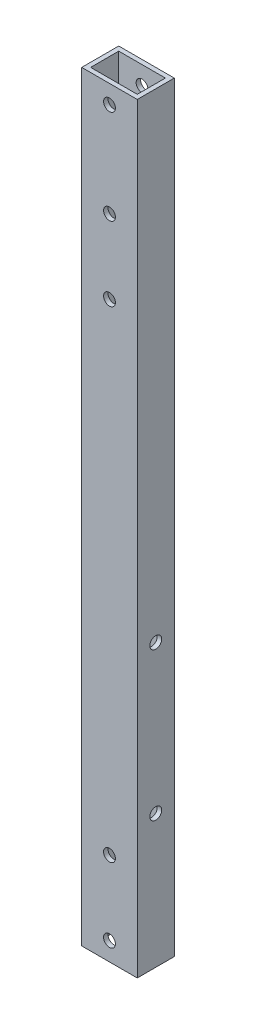
ISO-10303-21;
HEADER;
FILE_DESCRIPTION(('STEP AP214'),'2;1');
FILE_NAME('part.step','',(''),(''),'','','');
FILE_SCHEMA(('AUTOMOTIVE_DESIGN { 1 0 10303 214 1 1 1 1 }'));
ENDSEC;
DATA;
#1=APPLICATION_CONTEXT('core data for automotive mechanical design processes');
#2=APPLICATION_PROTOCOL_DEFINITION('international standard','automotive_design',2000,#1);
#3=PRODUCT_CONTEXT('',#1,'mechanical');
#4=PRODUCT('Part','Part','',(#3));
#5=PRODUCT_RELATED_PRODUCT_CATEGORY('part','',(#4));
#6=PRODUCT_DEFINITION_FORMATION('','',#4);
#7=PRODUCT_DEFINITION_CONTEXT('part definition',#1,'design');
#8=PRODUCT_DEFINITION('design','',#6,#7);
#9=PRODUCT_DEFINITION_SHAPE('','',#8);
#10=(LENGTH_UNIT() NAMED_UNIT(*) SI_UNIT(.MILLI.,.METRE.));
#11=(NAMED_UNIT(*) PLANE_ANGLE_UNIT() SI_UNIT($,.RADIAN.));
#12=(NAMED_UNIT(*) SI_UNIT($,.STERADIAN.) SOLID_ANGLE_UNIT());
#13=UNCERTAINTY_MEASURE_WITH_UNIT(LENGTH_MEASURE(1.E-05),#10,'distance_accuracy_value','');
#14=(GEOMETRIC_REPRESENTATION_CONTEXT(3) GLOBAL_UNCERTAINTY_ASSIGNED_CONTEXT((#13)) GLOBAL_UNIT_ASSIGNED_CONTEXT((#10,
#11,#12)) REPRESENTATION_CONTEXT('',''));
#15=CARTESIAN_POINT('',(0.,0.,0.));
#16=DIRECTION('',(0.,0.,1.));
#17=DIRECTION('',(1.,0.,0.));
#18=AXIS2_PLACEMENT_3D('',#15,#16,#17);
#19=CARTESIAN_POINT('',(7.5,110.,-5.));
#20=DIRECTION('',(-1.,0.,0.));
#21=DIRECTION('',(0.,0.,1.));
#22=AXIS2_PLACEMENT_3D('',#19,#20,#21);
#23=PLANE('',#22);
#24=CARTESIAN_POINT('',(7.5,-34.,0.));
#25=DIRECTION('',(-1.,0.,0.));
#26=DIRECTION('',(0.,0.,1.));
#27=AXIS2_PLACEMENT_3D('',#24,#25,#26);
#28=CIRCLE('',#27,1.6);
#29=CARTESIAN_POINT('',(7.5,-34.,1.60000000000005));
#30=VERTEX_POINT('',#29);
#31=EDGE_CURVE('E169',#30,#30,#28,.T.);
#32=ORIENTED_EDGE('',*,*,#31,.T.);
#33=EDGE_LOOP('',(#32));
#34=FACE_BOUND('',#33,.T.);
#35=CARTESIAN_POINT('',(7.5,-74.,0.));
#36=DIRECTION('',(-1.,0.,0.));
#37=DIRECTION('',(0.,0.,1.));
#38=AXIS2_PLACEMENT_3D('',#35,#36,#37);
#39=CIRCLE('',#38,1.6);
#40=CARTESIAN_POINT('',(7.5,-74.,1.60000000000007));
#41=VERTEX_POINT('',#40);
#42=EDGE_CURVE('E138',#41,#41,#39,.T.);
#43=ORIENTED_EDGE('',*,*,#42,.T.);
#44=EDGE_LOOP('',(#43));
#45=FACE_BOUND('',#44,.T.);
#46=DIRECTION('',(0.,0.,-1.));
#47=VECTOR('',#46,1.);
#48=CARTESIAN_POINT('',(7.5,95.5,5.));
#49=LINE('',#48,#47);
#50=CARTESIAN_POINT('',(7.5,95.5,5.));
#51=VERTEX_POINT('',#50);
#52=CARTESIAN_POINT('',(7.5,95.5,-5.));
#53=VERTEX_POINT('',#52);
#54=EDGE_CURVE('E96',#51,#53,#49,.T.);
#55=ORIENTED_EDGE('',*,*,#54,.F.);
#56=DIRECTION('',(0.,-1.,0.));
#57=VECTOR('',#56,1.);
#58=CARTESIAN_POINT('',(7.5,110.,5.));
#59=LINE('',#58,#57);
#60=CARTESIAN_POINT('',(7.5,-110.,5.));
#61=VERTEX_POINT('',#60);
#62=EDGE_CURVE('E106',#51,#61,#59,.T.);
#63=ORIENTED_EDGE('',*,*,#62,.T.);
#64=DIRECTION('',(0.,0.,-1.));
#65=VECTOR('',#64,1.);
#66=CARTESIAN_POINT('',(7.5,-110.,-5.));
#67=LINE('',#66,#65);
#68=CARTESIAN_POINT('',(7.5,-110.,-5.));
#69=VERTEX_POINT('',#68);
#70=EDGE_CURVE('E212',#61,#69,#67,.T.);
#71=ORIENTED_EDGE('',*,*,#70,.T.);
#72=DIRECTION('',(0.,-1.,0.));
#73=VECTOR('',#72,1.);
#74=CARTESIAN_POINT('',(7.5,110.,-5.));
#75=LINE('',#74,#73);
#76=EDGE_CURVE('E40',#53,#69,#75,.T.);
#77=ORIENTED_EDGE('',*,*,#76,.F.);
#78=EDGE_LOOP('',(#55,#63,#71,#77));
#79=FACE_BOUND('',#78,.T.);
#80=ADVANCED_FACE('F32',(#34,#45,#79),#23,.F.);
#81=CARTESIAN_POINT('',(-7.5,110.,-5.));
#82=DIRECTION('',(0.,0.,1.));
#83=DIRECTION('',(1.,0.,0.));
#84=AXIS2_PLACEMENT_3D('',#81,#82,#83);
#85=PLANE('',#84);
#86=CARTESIAN_POINT('',(0.,90.5,-5.));
#87=DIRECTION('',(0.,0.,-1.));
#88=DIRECTION('',(-1.,0.,0.));
#89=AXIS2_PLACEMENT_3D('',#86,#87,#88);
#90=CIRCLE('',#89,1.60000000000001);
#91=CARTESIAN_POINT('',(-1.60000000000001,90.5,-5.));
#92=VERTEX_POINT('',#91);
#93=EDGE_CURVE('E384',#92,#92,#90,.T.);
#94=ORIENTED_EDGE('',*,*,#93,.F.);
#95=EDGE_LOOP('',(#94));
#96=FACE_BOUND('',#95,.T.);
#97=CARTESIAN_POINT('',(0.,-105.,-5.));
#98=DIRECTION('',(0.,0.,-1.));
#99=DIRECTION('',(-1.,0.,0.));
#100=AXIS2_PLACEMENT_3D('',#97,#98,#99);
#101=CIRCLE('',#100,1.60000000000001);
#102=CARTESIAN_POINT('',(-1.60000000000001,-105.,-5.));
#103=VERTEX_POINT('',#102);
#104=EDGE_CURVE('E178',#103,#103,#101,.T.);
#105=ORIENTED_EDGE('',*,*,#104,.F.);
#106=EDGE_LOOP('',(#105));
#107=FACE_BOUND('',#106,.T.);
#108=CARTESIAN_POINT('',(0.,-85.,-5.));
#109=DIRECTION('',(0.,0.,-1.));
#110=DIRECTION('',(-1.,0.,0.));
#111=AXIS2_PLACEMENT_3D('',#108,#109,#110);
#112=CIRCLE('',#111,1.6);
#113=CARTESIAN_POINT('',(-1.6,-85.,-5.));
#114=VERTEX_POINT('',#113);
#115=EDGE_CURVE('E128',#114,#114,#112,.T.);
#116=ORIENTED_EDGE('',*,*,#115,.F.);
#117=EDGE_LOOP('',(#116));
#118=FACE_BOUND('',#117,.T.);
#119=CARTESIAN_POINT('',(0.,65.,-5.));
#120=DIRECTION('',(0.,0.,-1.));
#121=DIRECTION('',(-1.,0.,0.));
#122=AXIS2_PLACEMENT_3D('',#119,#120,#121);
#123=CIRCLE('',#122,1.6);
#124=CARTESIAN_POINT('',(-1.6,65.,-5.));
#125=VERTEX_POINT('',#124);
#126=EDGE_CURVE('E161',#125,#125,#123,.T.);
#127=ORIENTED_EDGE('',*,*,#126,.F.);
#128=EDGE_LOOP('',(#127));
#129=FACE_BOUND('',#128,.T.);
#130=CARTESIAN_POINT('',(0.,45.,-5.));
#131=DIRECTION('',(0.,0.,-1.));
#132=DIRECTION('',(-1.,0.,0.));
#133=AXIS2_PLACEMENT_3D('',#130,#131,#132);
#134=CIRCLE('',#133,1.6);
#135=CARTESIAN_POINT('',(-1.6,45.,-5.));
#136=VERTEX_POINT('',#135);
#137=EDGE_CURVE('E239',#136,#136,#134,.T.);
#138=ORIENTED_EDGE('',*,*,#137,.F.);
#139=EDGE_LOOP('',(#138));
#140=FACE_BOUND('',#139,.T.);
#141=DIRECTION('',(-1.,0.,0.));
#142=VECTOR('',#141,1.);
#143=CARTESIAN_POINT('',(7.5,95.5,-5.));
#144=LINE('',#143,#142);
#145=CARTESIAN_POINT('',(-7.5,95.5,-5.));
#146=VERTEX_POINT('',#145);
#147=EDGE_CURVE('E108',#53,#146,#144,.T.);
#148=ORIENTED_EDGE('',*,*,#147,.F.);
#149=ORIENTED_EDGE('',*,*,#76,.T.);
#150=DIRECTION('',(-1.,0.,0.));
#151=VECTOR('',#150,1.);
#152=CARTESIAN_POINT('',(-7.5,-110.,-5.));
#153=LINE('',#152,#151);
#154=CARTESIAN_POINT('',(-7.5,-110.,-5.));
#155=VERTEX_POINT('',#154);
#156=EDGE_CURVE('E214',#69,#155,#153,.T.);
#157=ORIENTED_EDGE('',*,*,#156,.T.);
#158=DIRECTION('',(0.,-1.,0.));
#159=VECTOR('',#158,1.);
#160=CARTESIAN_POINT('',(-7.5,110.,-5.));
#161=LINE('',#160,#159);
#162=EDGE_CURVE('E116',#146,#155,#161,.T.);
#163=ORIENTED_EDGE('',*,*,#162,.F.);
#164=EDGE_LOOP('',(#148,#149,#157,#163));
#165=FACE_BOUND('',#164,.T.);
#166=ADVANCED_FACE('F226',(#96,#107,#118,#129,#140,#165),#85,.F.);
#167=CARTESIAN_POINT('',(-7.5,110.,-5.));
#168=DIRECTION('',(1.,0.,0.));
#169=DIRECTION('',(0.,0.,-1.));
#170=AXIS2_PLACEMENT_3D('',#167,#168,#169);
#171=PLANE('',#170);
#172=CARTESIAN_POINT('',(-7.5,-34.,0.));
#173=DIRECTION('',(-1.,0.,0.));
#174=DIRECTION('',(0.,0.,1.));
#175=AXIS2_PLACEMENT_3D('',#172,#173,#174);
#176=CIRCLE('',#175,1.6);
#177=CARTESIAN_POINT('',(-7.5,-34.,1.60000000000005));
#178=VERTEX_POINT('',#177);
#179=EDGE_CURVE('E154',#178,#178,#176,.T.);
#180=ORIENTED_EDGE('',*,*,#179,.F.);
#181=EDGE_LOOP('',(#180));
#182=FACE_BOUND('',#181,.T.);
#183=CARTESIAN_POINT('',(-7.5,-74.,0.));
#184=DIRECTION('',(-1.,0.,0.));
#185=DIRECTION('',(0.,0.,1.));
#186=AXIS2_PLACEMENT_3D('',#183,#184,#185);
#187=CIRCLE('',#186,1.6);
#188=CARTESIAN_POINT('',(-7.5,-74.,1.60000000000008));
#189=VERTEX_POINT('',#188);
#190=EDGE_CURVE('E166',#189,#189,#187,.T.);
#191=ORIENTED_EDGE('',*,*,#190,.F.);
#192=EDGE_LOOP('',(#191));
#193=FACE_BOUND('',#192,.T.);
#194=DIRECTION('',(0.,0.,1.));
#195=VECTOR('',#194,1.);
#196=CARTESIAN_POINT('',(-7.5,95.5,-5.));
#197=LINE('',#196,#195);
#198=CARTESIAN_POINT('',(-7.5,95.5,5.));
#199=VERTEX_POINT('',#198);
#200=EDGE_CURVE('E47',#146,#199,#197,.T.);
#201=ORIENTED_EDGE('',*,*,#200,.F.);
#202=ORIENTED_EDGE('',*,*,#162,.T.);
#203=DIRECTION('',(0.,0.,1.));
#204=VECTOR('',#203,1.);
#205=CARTESIAN_POINT('',(-7.5,-110.,-5.));
#206=LINE('',#205,#204);
#207=CARTESIAN_POINT('',(-7.5,-110.,5.));
#208=VERTEX_POINT('',#207);
#209=EDGE_CURVE('E118',#155,#208,#206,.T.);
#210=ORIENTED_EDGE('',*,*,#209,.T.);
#211=DIRECTION('',(0.,-1.,0.));
#212=VECTOR('',#211,1.);
#213=CARTESIAN_POINT('',(-7.5,110.,5.));
#214=LINE('',#213,#212);
#215=EDGE_CURVE('E114',#199,#208,#214,.T.);
#216=ORIENTED_EDGE('',*,*,#215,.F.);
#217=EDGE_LOOP('',(#201,#202,#210,#216));
#218=FACE_BOUND('',#217,.T.);
#219=ADVANCED_FACE('F219',(#182,#193,#218),#171,.F.);
#220=CARTESIAN_POINT('',(-7.5,110.,5.));
#221=DIRECTION('',(0.,0.,-1.));
#222=DIRECTION('',(-1.,0.,0.));
#223=AXIS2_PLACEMENT_3D('',#220,#221,#222);
#224=PLANE('',#223);
#225=CARTESIAN_POINT('',(0.,90.5,5.));
#226=DIRECTION('',(0.,0.,-1.));
#227=DIRECTION('',(-1.,0.,0.));
#228=AXIS2_PLACEMENT_3D('',#225,#226,#227);
#229=CIRCLE('',#228,1.60000000000001);
#230=CARTESIAN_POINT('',(-1.60000000000001,90.5,5.));
#231=VERTEX_POINT('',#230);
#232=EDGE_CURVE('E101',#231,#231,#229,.T.);
#233=ORIENTED_EDGE('',*,*,#232,.T.);
#234=EDGE_LOOP('',(#233));
#235=FACE_BOUND('',#234,.T.);
#236=CARTESIAN_POINT('',(0.,-105.,5.));
#237=DIRECTION('',(0.,0.,-1.));
#238=DIRECTION('',(-1.,0.,0.));
#239=AXIS2_PLACEMENT_3D('',#236,#237,#238);
#240=CIRCLE('',#239,1.60000000000001);
#241=CARTESIAN_POINT('',(-1.60000000000001,-105.,5.));
#242=VERTEX_POINT('',#241);
#243=EDGE_CURVE('E133',#242,#242,#240,.T.);
#244=ORIENTED_EDGE('',*,*,#243,.T.);
#245=EDGE_LOOP('',(#244));
#246=FACE_BOUND('',#245,.T.);
#247=CARTESIAN_POINT('',(0.,-85.,5.));
#248=DIRECTION('',(0.,0.,-1.));
#249=DIRECTION('',(-1.,0.,0.));
#250=AXIS2_PLACEMENT_3D('',#247,#248,#249);
#251=CIRCLE('',#250,1.6);
#252=CARTESIAN_POINT('',(-1.6,-85.,5.));
#253=VERTEX_POINT('',#252);
#254=EDGE_CURVE('E189',#253,#253,#251,.T.);
#255=ORIENTED_EDGE('',*,*,#254,.T.);
#256=EDGE_LOOP('',(#255));
#257=FACE_BOUND('',#256,.T.);
#258=CARTESIAN_POINT('',(0.,65.,5.));
#259=DIRECTION('',(0.,0.,-1.));
#260=DIRECTION('',(-1.,0.,0.));
#261=AXIS2_PLACEMENT_3D('',#258,#259,#260);
#262=CIRCLE('',#261,1.6);
#263=CARTESIAN_POINT('',(-1.6,65.,5.));
#264=VERTEX_POINT('',#263);
#265=EDGE_CURVE('E241',#264,#264,#262,.T.);
#266=ORIENTED_EDGE('',*,*,#265,.T.);
#267=EDGE_LOOP('',(#266));
#268=FACE_BOUND('',#267,.T.);
#269=CARTESIAN_POINT('',(0.,45.,5.));
#270=DIRECTION('',(0.,0.,-1.));
#271=DIRECTION('',(-1.,0.,0.));
#272=AXIS2_PLACEMENT_3D('',#269,#270,#271);
#273=CIRCLE('',#272,1.6);
#274=CARTESIAN_POINT('',(-1.6,45.,5.));
#275=VERTEX_POINT('',#274);
#276=EDGE_CURVE('E147',#275,#275,#273,.T.);
#277=ORIENTED_EDGE('',*,*,#276,.T.);
#278=EDGE_LOOP('',(#277));
#279=FACE_BOUND('',#278,.T.);
#280=DIRECTION('',(1.,0.,0.));
#281=VECTOR('',#280,1.);
#282=CARTESIAN_POINT('',(-7.5,95.5,5.));
#283=LINE('',#282,#281);
#284=EDGE_CURVE('E93',#199,#51,#283,.T.);
#285=ORIENTED_EDGE('',*,*,#284,.F.);
#286=ORIENTED_EDGE('',*,*,#215,.T.);
#287=DIRECTION('',(1.,0.,0.));
#288=VECTOR('',#287,1.);
#289=CARTESIAN_POINT('',(-7.5,-110.,5.));
#290=LINE('',#289,#288);
#291=EDGE_CURVE('E112',#208,#61,#290,.T.);
#292=ORIENTED_EDGE('',*,*,#291,.T.);
#293=ORIENTED_EDGE('',*,*,#62,.F.);
#294=EDGE_LOOP('',(#285,#286,#292,#293));
#295=FACE_BOUND('',#294,.T.);
#296=ADVANCED_FACE('F110',(#235,#246,#257,#268,#279,#295),#224,.F.);
#297=CARTESIAN_POINT('',(-6.3,110.,-3.8));
#298=DIRECTION('',(1.,0.,0.));
#299=DIRECTION('',(0.,0.,-1.));
#300=AXIS2_PLACEMENT_3D('',#297,#298,#299);
#301=PLANE('',#300);
#302=CARTESIAN_POINT('',(-6.3,-74.,0.));
#303=DIRECTION('',(1.,0.,0.));
#304=DIRECTION('',(0.,0.,-1.));
#305=AXIS2_PLACEMENT_3D('',#302,#303,#304);
#306=CIRCLE('',#305,1.6);
#307=CARTESIAN_POINT('',(-6.3,-74.,-1.59999999999992));
#308=VERTEX_POINT('',#307);
#309=EDGE_CURVE('E142',#308,#308,#306,.T.);
#310=ORIENTED_EDGE('',*,*,#309,.F.);
#311=EDGE_LOOP('',(#310));
#312=FACE_BOUND('',#311,.T.);
#313=CARTESIAN_POINT('',(-6.3,-34.,0.));
#314=DIRECTION('',(1.,0.,0.));
#315=DIRECTION('',(0.,0.,-1.));
#316=AXIS2_PLACEMENT_3D('',#313,#314,#315);
#317=CIRCLE('',#316,1.6);
#318=CARTESIAN_POINT('',(-6.3,-34.,-1.59999999999995));
#319=VERTEX_POINT('',#318);
#320=EDGE_CURVE('E137',#319,#319,#317,.T.);
#321=ORIENTED_EDGE('',*,*,#320,.F.);
#322=EDGE_LOOP('',(#321));
#323=FACE_BOUND('',#322,.T.);
#324=DIRECTION('',(0.,-1.,0.));
#325=VECTOR('',#324,1.);
#326=CARTESIAN_POINT('',(-6.3,110.,-3.8));
#327=LINE('',#326,#325);
#328=CARTESIAN_POINT('',(-6.3,95.5,-3.8));
#329=VERTEX_POINT('',#328);
#330=CARTESIAN_POINT('',(-6.3,-110.,-3.8));
#331=VERTEX_POINT('',#330);
#332=EDGE_CURVE('E204',#329,#331,#327,.T.);
#333=ORIENTED_EDGE('',*,*,#332,.F.);
#334=DIRECTION('',(0.,0.,1.));
#335=VECTOR('',#334,1.);
#336=CARTESIAN_POINT('',(-6.3,95.5,-3.8));
#337=LINE('',#336,#335);
#338=CARTESIAN_POINT('',(-6.3,95.5,3.8));
#339=VERTEX_POINT('',#338);
#340=EDGE_CURVE('E55',#329,#339,#337,.T.);
#341=ORIENTED_EDGE('',*,*,#340,.T.);
#342=DIRECTION('',(0.,-1.,0.));
#343=VECTOR('',#342,1.);
#344=CARTESIAN_POINT('',(-6.3,110.,3.8));
#345=LINE('',#344,#343);
#346=CARTESIAN_POINT('',(-6.3,-110.,3.8));
#347=VERTEX_POINT('',#346);
#348=EDGE_CURVE('E210',#339,#347,#345,.T.);
#349=ORIENTED_EDGE('',*,*,#348,.T.);
#350=DIRECTION('',(0.,0.,1.));
#351=VECTOR('',#350,1.);
#352=CARTESIAN_POINT('',(-6.3,-110.,-3.8));
#353=LINE('',#352,#351);
#354=EDGE_CURVE('E192',#331,#347,#353,.T.);
#355=ORIENTED_EDGE('',*,*,#354,.F.);
#356=EDGE_LOOP('',(#333,#341,#349,#355));
#357=FACE_BOUND('',#356,.T.);
#358=ADVANCED_FACE('F306',(#312,#323,#357),#301,.T.);
#359=CARTESIAN_POINT('',(-6.3,110.,3.8));
#360=DIRECTION('',(0.,0.,-1.));
#361=DIRECTION('',(-1.,0.,0.));
#362=AXIS2_PLACEMENT_3D('',#359,#360,#361);
#363=PLANE('',#362);
#364=CARTESIAN_POINT('',(0.,90.5,3.8));
#365=DIRECTION('',(0.,0.,-1.));
#366=DIRECTION('',(-1.,0.,0.));
#367=AXIS2_PLACEMENT_3D('',#364,#365,#366);
#368=CIRCLE('',#367,1.60000000000001);
#369=CARTESIAN_POINT('',(-1.60000000000001,90.5,3.8));
#370=VERTEX_POINT('',#369);
#371=EDGE_CURVE('E386',#370,#370,#368,.T.);
#372=ORIENTED_EDGE('',*,*,#371,.F.);
#373=EDGE_LOOP('',(#372));
#374=FACE_BOUND('',#373,.T.);
#375=CARTESIAN_POINT('',(0.,45.,3.8));
#376=DIRECTION('',(0.,0.,-1.));
#377=DIRECTION('',(-1.,0.,0.));
#378=AXIS2_PLACEMENT_3D('',#375,#376,#377);
#379=CIRCLE('',#378,1.6);
#380=CARTESIAN_POINT('',(-1.6,45.,3.8));
#381=VERTEX_POINT('',#380);
#382=EDGE_CURVE('E150',#381,#381,#379,.T.);
#383=ORIENTED_EDGE('',*,*,#382,.F.);
#384=EDGE_LOOP('',(#383));
#385=FACE_BOUND('',#384,.T.);
#386=CARTESIAN_POINT('',(0.,65.,3.8));
#387=DIRECTION('',(0.,0.,-1.));
#388=DIRECTION('',(-1.,0.,0.));
#389=AXIS2_PLACEMENT_3D('',#386,#387,#388);
#390=CIRCLE('',#389,1.6);
#391=CARTESIAN_POINT('',(-1.6,65.,3.8));
#392=VERTEX_POINT('',#391);
#393=EDGE_CURVE('E146',#392,#392,#390,.T.);
#394=ORIENTED_EDGE('',*,*,#393,.F.);
#395=EDGE_LOOP('',(#394));
#396=FACE_BOUND('',#395,.T.);
#397=CARTESIAN_POINT('',(0.,-85.,3.8));
#398=DIRECTION('',(0.,0.,-1.));
#399=DIRECTION('',(-1.,0.,0.));
#400=AXIS2_PLACEMENT_3D('',#397,#398,#399);
#401=CIRCLE('',#400,1.6);
#402=CARTESIAN_POINT('',(-1.6,-85.,3.8));
#403=VERTEX_POINT('',#402);
#404=EDGE_CURVE('E132',#403,#403,#401,.T.);
#405=ORIENTED_EDGE('',*,*,#404,.F.);
#406=EDGE_LOOP('',(#405));
#407=FACE_BOUND('',#406,.T.);
#408=CARTESIAN_POINT('',(0.,-105.,3.8));
#409=DIRECTION('',(0.,0.,-1.));
#410=DIRECTION('',(-1.,0.,0.));
#411=AXIS2_PLACEMENT_3D('',#408,#409,#410);
#412=CIRCLE('',#411,1.60000000000001);
#413=CARTESIAN_POINT('',(-1.60000000000001,-105.,3.8));
#414=VERTEX_POINT('',#413);
#415=EDGE_CURVE('E127',#414,#414,#412,.T.);
#416=ORIENTED_EDGE('',*,*,#415,.F.);
#417=EDGE_LOOP('',(#416));
#418=FACE_BOUND('',#417,.T.);
#419=ORIENTED_EDGE('',*,*,#348,.F.);
#420=DIRECTION('',(1.,0.,0.));
#421=VECTOR('',#420,1.);
#422=CARTESIAN_POINT('',(-6.3,95.5,3.8));
#423=LINE('',#422,#421);
#424=CARTESIAN_POINT('',(6.3,95.5,3.8));
#425=VERTEX_POINT('',#424);
#426=EDGE_CURVE('E233',#339,#425,#423,.T.);
#427=ORIENTED_EDGE('',*,*,#426,.T.);
#428=DIRECTION('',(0.,-1.,0.));
#429=VECTOR('',#428,1.);
#430=CARTESIAN_POINT('',(6.3,110.,3.8));
#431=LINE('',#430,#429);
#432=CARTESIAN_POINT('',(6.3,-110.,3.8));
#433=VERTEX_POINT('',#432);
#434=EDGE_CURVE('E208',#425,#433,#431,.T.);
#435=ORIENTED_EDGE('',*,*,#434,.T.);
#436=DIRECTION('',(1.,0.,0.));
#437=VECTOR('',#436,1.);
#438=CARTESIAN_POINT('',(-6.3,-110.,3.8));
#439=LINE('',#438,#437);
#440=EDGE_CURVE('E195',#347,#433,#439,.T.);
#441=ORIENTED_EDGE('',*,*,#440,.F.);
#442=EDGE_LOOP('',(#419,#427,#435,#441));
#443=FACE_BOUND('',#442,.T.);
#444=ADVANCED_FACE('F317',(#374,#385,#396,#407,#418,#443),#363,.T.);
#445=CARTESIAN_POINT('',(6.3,110.,-3.8));
#446=DIRECTION('',(-1.,0.,0.));
#447=DIRECTION('',(0.,0.,1.));
#448=AXIS2_PLACEMENT_3D('',#445,#446,#447);
#449=PLANE('',#448);
#450=CARTESIAN_POINT('',(6.3,-74.,0.));
#451=DIRECTION('',(-1.,0.,0.));
#452=DIRECTION('',(0.,0.,1.));
#453=AXIS2_PLACEMENT_3D('',#450,#451,#452);
#454=CIRCLE('',#453,1.6);
#455=CARTESIAN_POINT('',(6.3,-74.,1.60000000000007));
#456=VERTEX_POINT('',#455);
#457=EDGE_CURVE('E139',#456,#456,#454,.T.);
#458=ORIENTED_EDGE('',*,*,#457,.F.);
#459=EDGE_LOOP('',(#458));
#460=FACE_BOUND('',#459,.T.);
#461=CARTESIAN_POINT('',(6.3,-34.,0.));
#462=DIRECTION('',(-1.,0.,0.));
#463=DIRECTION('',(0.,0.,1.));
#464=AXIS2_PLACEMENT_3D('',#461,#462,#463);
#465=CIRCLE('',#464,1.6);
#466=CARTESIAN_POINT('',(6.3,-34.,1.60000000000005));
#467=VERTEX_POINT('',#466);
#468=EDGE_CURVE('E134',#467,#467,#465,.T.);
#469=ORIENTED_EDGE('',*,*,#468,.F.);
#470=EDGE_LOOP('',(#469));
#471=FACE_BOUND('',#470,.T.);
#472=ORIENTED_EDGE('',*,*,#434,.F.);
#473=DIRECTION('',(0.,0.,-1.));
#474=VECTOR('',#473,1.);
#475=CARTESIAN_POINT('',(6.3,95.5,-3.8));
#476=LINE('',#475,#474);
#477=CARTESIAN_POINT('',(6.3,95.5,-3.8));
#478=VERTEX_POINT('',#477);
#479=EDGE_CURVE('E228',#425,#478,#476,.T.);
#480=ORIENTED_EDGE('',*,*,#479,.T.);
#481=DIRECTION('',(0.,-1.,0.));
#482=VECTOR('',#481,1.);
#483=CARTESIAN_POINT('',(6.3,110.,-3.8));
#484=LINE('',#483,#482);
#485=CARTESIAN_POINT('',(6.3,-110.,-3.8));
#486=VERTEX_POINT('',#485);
#487=EDGE_CURVE('E206',#478,#486,#484,.T.);
#488=ORIENTED_EDGE('',*,*,#487,.T.);
#489=DIRECTION('',(0.,0.,-1.));
#490=VECTOR('',#489,1.);
#491=CARTESIAN_POINT('',(6.3,-110.,-3.8));
#492=LINE('',#491,#490);
#493=EDGE_CURVE('E198',#433,#486,#492,.T.);
#494=ORIENTED_EDGE('',*,*,#493,.F.);
#495=EDGE_LOOP('',(#472,#480,#488,#494));
#496=FACE_BOUND('',#495,.T.);
#497=ADVANCED_FACE('F321',(#460,#471,#496),#449,.T.);
#498=CARTESIAN_POINT('',(-6.3,110.,-3.8));
#499=DIRECTION('',(0.,0.,1.));
#500=DIRECTION('',(1.,0.,0.));
#501=AXIS2_PLACEMENT_3D('',#498,#499,#500);
#502=PLANE('',#501);
#503=CARTESIAN_POINT('',(0.,90.5,-3.8));
#504=DIRECTION('',(0.,0.,1.));
#505=DIRECTION('',(1.,0.,0.));
#506=AXIS2_PLACEMENT_3D('',#503,#504,#505);
#507=CIRCLE('',#506,1.60000000000001);
#508=CARTESIAN_POINT('',(1.60000000000001,90.5,-3.8));
#509=VERTEX_POINT('',#508);
#510=EDGE_CURVE('E35',#509,#509,#507,.T.);
#511=ORIENTED_EDGE('',*,*,#510,.F.);
#512=EDGE_LOOP('',(#511));
#513=FACE_BOUND('',#512,.T.);
#514=CARTESIAN_POINT('',(0.,45.,-3.8));
#515=DIRECTION('',(0.,0.,1.));
#516=DIRECTION('',(1.,0.,0.));
#517=AXIS2_PLACEMENT_3D('',#514,#515,#516);
#518=CIRCLE('',#517,1.6);
#519=CARTESIAN_POINT('',(1.6,45.,-3.8));
#520=VERTEX_POINT('',#519);
#521=EDGE_CURVE('E148',#520,#520,#518,.T.);
#522=ORIENTED_EDGE('',*,*,#521,.F.);
#523=EDGE_LOOP('',(#522));
#524=FACE_BOUND('',#523,.T.);
#525=CARTESIAN_POINT('',(0.,65.,-3.8));
#526=DIRECTION('',(0.,0.,1.));
#527=DIRECTION('',(1.,0.,0.));
#528=AXIS2_PLACEMENT_3D('',#525,#526,#527);
#529=CIRCLE('',#528,1.6);
#530=CARTESIAN_POINT('',(1.6,65.,-3.8));
#531=VERTEX_POINT('',#530);
#532=EDGE_CURVE('E143',#531,#531,#529,.T.);
#533=ORIENTED_EDGE('',*,*,#532,.F.);
#534=EDGE_LOOP('',(#533));
#535=FACE_BOUND('',#534,.T.);
#536=CARTESIAN_POINT('',(0.,-85.,-3.8));
#537=DIRECTION('',(0.,0.,1.));
#538=DIRECTION('',(1.,0.,0.));
#539=AXIS2_PLACEMENT_3D('',#536,#537,#538);
#540=CIRCLE('',#539,1.6);
#541=CARTESIAN_POINT('',(1.6,-85.,-3.8));
#542=VERTEX_POINT('',#541);
#543=EDGE_CURVE('E129',#542,#542,#540,.T.);
#544=ORIENTED_EDGE('',*,*,#543,.F.);
#545=EDGE_LOOP('',(#544));
#546=FACE_BOUND('',#545,.T.);
#547=CARTESIAN_POINT('',(0.,-105.,-3.8));
#548=DIRECTION('',(0.,0.,1.));
#549=DIRECTION('',(1.,0.,0.));
#550=AXIS2_PLACEMENT_3D('',#547,#548,#549);
#551=CIRCLE('',#550,1.60000000000001);
#552=CARTESIAN_POINT('',(1.60000000000001,-105.,-3.8));
#553=VERTEX_POINT('',#552);
#554=EDGE_CURVE('E124',#553,#553,#551,.T.);
#555=ORIENTED_EDGE('',*,*,#554,.F.);
#556=EDGE_LOOP('',(#555));
#557=FACE_BOUND('',#556,.T.);
#558=ORIENTED_EDGE('',*,*,#487,.F.);
#559=DIRECTION('',(-1.,0.,0.));
#560=VECTOR('',#559,1.);
#561=CARTESIAN_POINT('',(-6.3,95.5,-3.8));
#562=LINE('',#561,#560);
#563=EDGE_CURVE('E11',#478,#329,#562,.T.);
#564=ORIENTED_EDGE('',*,*,#563,.T.);
#565=ORIENTED_EDGE('',*,*,#332,.T.);
#566=DIRECTION('',(-1.,0.,0.));
#567=VECTOR('',#566,1.);
#568=CARTESIAN_POINT('',(-6.3,-110.,-3.8));
#569=LINE('',#568,#567);
#570=EDGE_CURVE('E201',#486,#331,#569,.T.);
#571=ORIENTED_EDGE('',*,*,#570,.F.);
#572=EDGE_LOOP('',(#558,#564,#565,#571));
#573=FACE_BOUND('',#572,.T.);
#574=ADVANCED_FACE('F314',(#513,#524,#535,#546,#557,#573),#502,.T.);
#575=CARTESIAN_POINT('',(0.,-110.,0.));
#576=DIRECTION('',(0.,1.,0.));
#577=DIRECTION('',(0.,0.,1.));
#578=AXIS2_PLACEMENT_3D('',#575,#576,#577);
#579=PLANE('',#578);
#580=ORIENTED_EDGE('',*,*,#70,.F.);
#581=ORIENTED_EDGE('',*,*,#291,.F.);
#582=ORIENTED_EDGE('',*,*,#209,.F.);
#583=ORIENTED_EDGE('',*,*,#156,.F.);
#584=EDGE_LOOP('',(#580,#581,#582,#583));
#585=FACE_BOUND('',#584,.T.);
#586=ORIENTED_EDGE('',*,*,#354,.T.);
#587=ORIENTED_EDGE('',*,*,#440,.T.);
#588=ORIENTED_EDGE('',*,*,#493,.T.);
#589=ORIENTED_EDGE('',*,*,#570,.T.);
#590=EDGE_LOOP('',(#586,#587,#588,#589));
#591=FACE_BOUND('',#590,.T.);
#592=ADVANCED_FACE('F223',(#585,#591),#579,.F.);
#593=CARTESIAN_POINT('',(0.,-105.,95.));
#594=DIRECTION('',(0.,0.,-1.));
#595=DIRECTION('',(-1.,0.,0.));
#596=AXIS2_PLACEMENT_3D('',#593,#594,#595);
#597=CYLINDRICAL_SURFACE('',#596,1.60000000000001);
#598=ORIENTED_EDGE('',*,*,#554,.T.);
#599=EDGE_LOOP('',(#598));
#600=FACE_BOUND('',#599,.T.);
#601=ORIENTED_EDGE('',*,*,#104,.T.);
#602=EDGE_LOOP('',(#601));
#603=FACE_BOUND('',#602,.T.);
#604=ADVANCED_FACE('F313',(#600,#603),#597,.F.);
#605=CARTESIAN_POINT('',(0.,-85.,95.));
#606=DIRECTION('',(0.,0.,-1.));
#607=DIRECTION('',(-1.,0.,0.));
#608=AXIS2_PLACEMENT_3D('',#605,#606,#607);
#609=CYLINDRICAL_SURFACE('',#608,1.6);
#610=ORIENTED_EDGE('',*,*,#543,.T.);
#611=EDGE_LOOP('',(#610));
#612=FACE_BOUND('',#611,.T.);
#613=ORIENTED_EDGE('',*,*,#115,.T.);
#614=EDGE_LOOP('',(#613));
#615=FACE_BOUND('',#614,.T.);
#616=ADVANCED_FACE('F331',(#612,#615),#609,.F.);
#617=ORIENTED_EDGE('',*,*,#415,.T.);
#618=EDGE_LOOP('',(#617));
#619=FACE_BOUND('',#618,.T.);
#620=ORIENTED_EDGE('',*,*,#243,.F.);
#621=EDGE_LOOP('',(#620));
#622=FACE_BOUND('',#621,.T.);
#623=ADVANCED_FACE('F333',(#619,#622),#597,.F.);
#624=ORIENTED_EDGE('',*,*,#404,.T.);
#625=EDGE_LOOP('',(#624));
#626=FACE_BOUND('',#625,.T.);
#627=ORIENTED_EDGE('',*,*,#254,.F.);
#628=EDGE_LOOP('',(#627));
#629=FACE_BOUND('',#628,.T.);
#630=ADVANCED_FACE('F290',(#626,#629),#609,.F.);
#631=CARTESIAN_POINT('',(7.5,-34.,0.));
#632=DIRECTION('',(-1.,0.,0.));
#633=DIRECTION('',(0.,0.,1.));
#634=AXIS2_PLACEMENT_3D('',#631,#632,#633);
#635=CYLINDRICAL_SURFACE('',#634,1.6);
#636=ORIENTED_EDGE('',*,*,#468,.T.);
#637=EDGE_LOOP('',(#636));
#638=FACE_BOUND('',#637,.T.);
#639=ORIENTED_EDGE('',*,*,#31,.F.);
#640=EDGE_LOOP('',(#639));
#641=FACE_BOUND('',#640,.T.);
#642=ADVANCED_FACE('F281',(#638,#641),#635,.F.);
#643=CARTESIAN_POINT('',(7.5,-74.,0.));
#644=DIRECTION('',(-1.,0.,0.));
#645=DIRECTION('',(0.,0.,1.));
#646=AXIS2_PLACEMENT_3D('',#643,#644,#645);
#647=CYLINDRICAL_SURFACE('',#646,1.6);
#648=ORIENTED_EDGE('',*,*,#457,.T.);
#649=EDGE_LOOP('',(#648));
#650=FACE_BOUND('',#649,.T.);
#651=ORIENTED_EDGE('',*,*,#42,.F.);
#652=EDGE_LOOP('',(#651));
#653=FACE_BOUND('',#652,.T.);
#654=ADVANCED_FACE('F278',(#650,#653),#647,.F.);
#655=ORIENTED_EDGE('',*,*,#320,.T.);
#656=EDGE_LOOP('',(#655));
#657=FACE_BOUND('',#656,.T.);
#658=ORIENTED_EDGE('',*,*,#179,.T.);
#659=EDGE_LOOP('',(#658));
#660=FACE_BOUND('',#659,.T.);
#661=ADVANCED_FACE('F280',(#657,#660),#635,.F.);
#662=ORIENTED_EDGE('',*,*,#309,.T.);
#663=EDGE_LOOP('',(#662));
#664=FACE_BOUND('',#663,.T.);
#665=ORIENTED_EDGE('',*,*,#190,.T.);
#666=EDGE_LOOP('',(#665));
#667=FACE_BOUND('',#666,.T.);
#668=ADVANCED_FACE('F265',(#664,#667),#647,.F.);
#669=CARTESIAN_POINT('',(0.,65.,5.));
#670=DIRECTION('',(0.,0.,-1.));
#671=DIRECTION('',(-1.,0.,0.));
#672=AXIS2_PLACEMENT_3D('',#669,#670,#671);
#673=CYLINDRICAL_SURFACE('',#672,1.6);
#674=ORIENTED_EDGE('',*,*,#532,.T.);
#675=EDGE_LOOP('',(#674));
#676=FACE_BOUND('',#675,.T.);
#677=ORIENTED_EDGE('',*,*,#126,.T.);
#678=EDGE_LOOP('',(#677));
#679=FACE_BOUND('',#678,.T.);
#680=ADVANCED_FACE('F248',(#676,#679),#673,.F.);
#681=CARTESIAN_POINT('',(0.,45.,5.));
#682=DIRECTION('',(0.,0.,-1.));
#683=DIRECTION('',(-1.,0.,0.));
#684=AXIS2_PLACEMENT_3D('',#681,#682,#683);
#685=CYLINDRICAL_SURFACE('',#684,1.6);
#686=ORIENTED_EDGE('',*,*,#521,.T.);
#687=EDGE_LOOP('',(#686));
#688=FACE_BOUND('',#687,.T.);
#689=ORIENTED_EDGE('',*,*,#137,.T.);
#690=EDGE_LOOP('',(#689));
#691=FACE_BOUND('',#690,.T.);
#692=ADVANCED_FACE('F255',(#688,#691),#685,.F.);
#693=ORIENTED_EDGE('',*,*,#393,.T.);
#694=EDGE_LOOP('',(#693));
#695=FACE_BOUND('',#694,.T.);
#696=ORIENTED_EDGE('',*,*,#265,.F.);
#697=EDGE_LOOP('',(#696));
#698=FACE_BOUND('',#697,.T.);
#699=ADVANCED_FACE('F257',(#695,#698),#673,.F.);
#700=ORIENTED_EDGE('',*,*,#382,.T.);
#701=EDGE_LOOP('',(#700));
#702=FACE_BOUND('',#701,.T.);
#703=ORIENTED_EDGE('',*,*,#276,.F.);
#704=EDGE_LOOP('',(#703));
#705=FACE_BOUND('',#704,.T.);
#706=ADVANCED_FACE('F259',(#702,#705),#685,.F.);
#707=CARTESIAN_POINT('',(0.,95.5,0.));
#708=DIRECTION('',(0.,1.,0.));
#709=DIRECTION('',(0.,0.,1.));
#710=AXIS2_PLACEMENT_3D('',#707,#708,#709);
#711=PLANE('',#710);
#712=ORIENTED_EDGE('',*,*,#563,.F.);
#713=ORIENTED_EDGE('',*,*,#479,.F.);
#714=ORIENTED_EDGE('',*,*,#426,.F.);
#715=ORIENTED_EDGE('',*,*,#340,.F.);
#716=EDGE_LOOP('',(#712,#713,#714,#715));
#717=FACE_BOUND('',#716,.T.);
#718=ORIENTED_EDGE('',*,*,#284,.T.);
#719=ORIENTED_EDGE('',*,*,#54,.T.);
#720=ORIENTED_EDGE('',*,*,#147,.T.);
#721=ORIENTED_EDGE('',*,*,#200,.T.);
#722=EDGE_LOOP('',(#718,#719,#720,#721));
#723=FACE_BOUND('',#722,.T.);
#724=ADVANCED_FACE('F95',(#717,#723),#711,.T.);
#725=CARTESIAN_POINT('',(0.,90.5,10.));
#726=DIRECTION('',(0.,0.,-1.));
#727=DIRECTION('',(-1.,0.,0.));
#728=AXIS2_PLACEMENT_3D('',#725,#726,#727);
#729=CYLINDRICAL_SURFACE('',#728,1.60000000000001);
#730=ORIENTED_EDGE('',*,*,#510,.T.);
#731=EDGE_LOOP('',(#730));
#732=FACE_BOUND('',#731,.T.);
#733=ORIENTED_EDGE('',*,*,#93,.T.);
#734=EDGE_LOOP('',(#733));
#735=FACE_BOUND('',#734,.T.);
#736=ADVANCED_FACE('F368',(#732,#735),#729,.F.);
#737=ORIENTED_EDGE('',*,*,#371,.T.);
#738=EDGE_LOOP('',(#737));
#739=FACE_BOUND('',#738,.T.);
#740=ORIENTED_EDGE('',*,*,#232,.F.);
#741=EDGE_LOOP('',(#740));
#742=FACE_BOUND('',#741,.T.);
#743=ADVANCED_FACE('F372',(#739,#742),#729,.F.);
#744=CLOSED_SHELL('',(#80,#166,#219,#296,#358,#444,#497,#574,#592,#604,#616,#623,#630,#642,#654,
#661,#668,#680,#692,#699,#706,#724,#736,#743));
#745=MANIFOLD_SOLID_BREP('B2',#744);
#746=ADVANCED_BREP_SHAPE_REPRESENTATION('',(#18,#745),#14);
#747=SHAPE_DEFINITION_REPRESENTATION(#9,#746);
ENDSEC;
END-ISO-10303-21;
